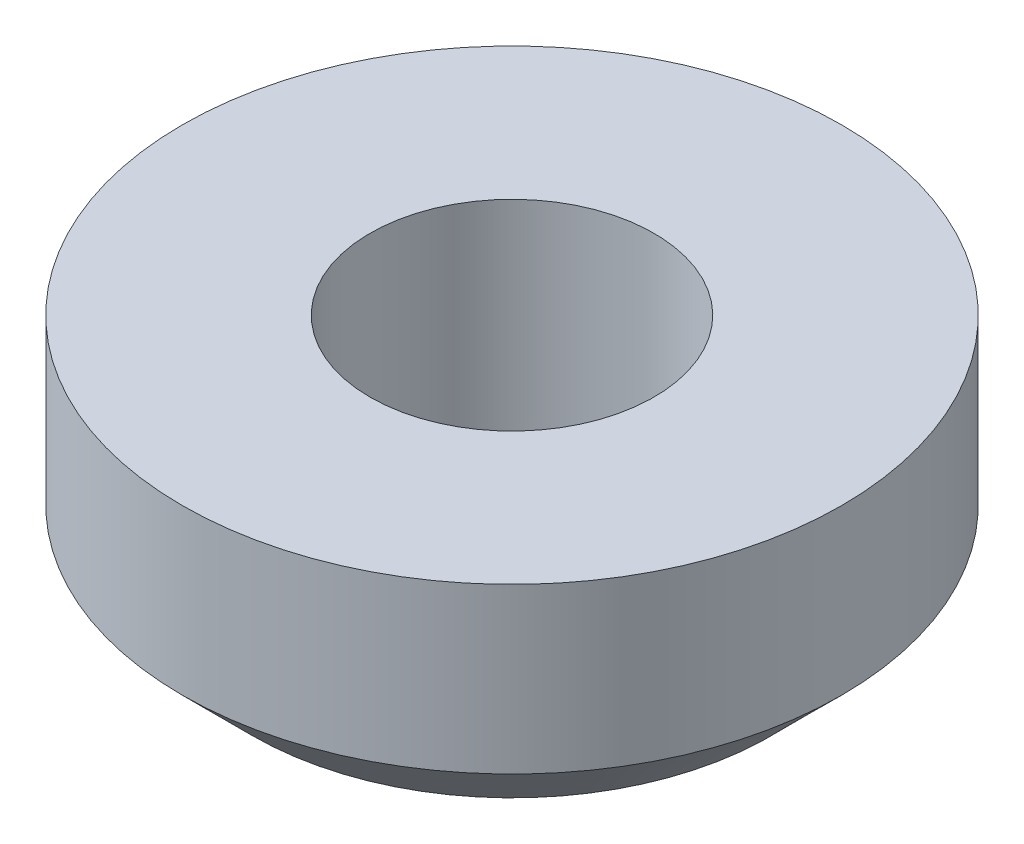
ISO-10303-21;
HEADER;
FILE_DESCRIPTION(('STEP AP214'),'2;1');
FILE_NAME('part.step','',(''),(''),'','','');
FILE_SCHEMA(('AUTOMOTIVE_DESIGN { 1 0 10303 214 1 1 1 1 }'));
ENDSEC;
DATA;
#1=APPLICATION_CONTEXT('core data for automotive mechanical design processes');
#2=APPLICATION_PROTOCOL_DEFINITION('international standard','automotive_design',2000,#1);
#3=PRODUCT_CONTEXT('',#1,'mechanical');
#4=PRODUCT('Part','Part','',(#3));
#5=PRODUCT_RELATED_PRODUCT_CATEGORY('part','',(#4));
#6=PRODUCT_DEFINITION_FORMATION('','',#4);
#7=PRODUCT_DEFINITION_CONTEXT('part definition',#1,'design');
#8=PRODUCT_DEFINITION('design','',#6,#7);
#9=PRODUCT_DEFINITION_SHAPE('','',#8);
#10=(LENGTH_UNIT() NAMED_UNIT(*) SI_UNIT(.MILLI.,.METRE.));
#11=(NAMED_UNIT(*) PLANE_ANGLE_UNIT() SI_UNIT($,.RADIAN.));
#12=(NAMED_UNIT(*) SI_UNIT($,.STERADIAN.) SOLID_ANGLE_UNIT());
#13=UNCERTAINTY_MEASURE_WITH_UNIT(LENGTH_MEASURE(1.E-05),#10,'distance_accuracy_value','');
#14=(GEOMETRIC_REPRESENTATION_CONTEXT(3) GLOBAL_UNCERTAINTY_ASSIGNED_CONTEXT((#13)) GLOBAL_UNIT_ASSIGNED_CONTEXT((#10,
#11,#12)) REPRESENTATION_CONTEXT('',''));
#15=CARTESIAN_POINT('',(0.,0.,0.));
#16=DIRECTION('',(0.,0.,1.));
#17=DIRECTION('',(1.,0.,0.));
#18=AXIS2_PLACEMENT_3D('',#15,#16,#17);
#19=CARTESIAN_POINT('',(0.,5.,0.));
#20=DIRECTION('',(0.,1.,0.));
#21=DIRECTION('',(0.,0.,1.));
#22=AXIS2_PLACEMENT_3D('',#19,#20,#21);
#23=PLANE('',#22);
#24=CARTESIAN_POINT('',(0.,5.,0.));
#25=DIRECTION('',(0.,1.,0.));
#26=DIRECTION('',(0.,0.,1.));
#27=AXIS2_PLACEMENT_3D('',#24,#25,#26);
#28=CIRCLE('',#27,7.025);
#29=CARTESIAN_POINT('',(0.,5.,7.025));
#30=VERTEX_POINT('',#29);
#31=EDGE_CURVE('E48',#30,#30,#28,.T.);
#32=ORIENTED_EDGE('',*,*,#31,.T.);
#33=EDGE_LOOP('',(#32));
#34=FACE_BOUND('',#33,.T.);
#35=CARTESIAN_POINT('',(0.,5.,0.));
#36=DIRECTION('',(0.,1.,0.));
#37=DIRECTION('',(0.,0.,1.));
#38=AXIS2_PLACEMENT_3D('',#35,#36,#37);
#39=CIRCLE('',#38,3.025);
#40=CARTESIAN_POINT('',(0.,5.,3.025));
#41=VERTEX_POINT('',#40);
#42=EDGE_CURVE('E52',#41,#41,#39,.T.);
#43=ORIENTED_EDGE('',*,*,#42,.F.);
#44=EDGE_LOOP('',(#43));
#45=FACE_BOUND('',#44,.T.);
#46=ADVANCED_FACE('F36',(#34,#45),#23,.T.);
#47=CARTESIAN_POINT('',(0.,0.,0.));
#48=DIRECTION('',(0.,1.,0.));
#49=DIRECTION('',(0.,0.,1.));
#50=AXIS2_PLACEMENT_3D('',#47,#48,#49);
#51=PLANE('',#50);
#52=CARTESIAN_POINT('',(0.,0.,0.));
#53=DIRECTION('',(0.,1.,0.));
#54=DIRECTION('',(0.,0.,1.));
#55=AXIS2_PLACEMENT_3D('',#52,#53,#54);
#56=CIRCLE('',#55,5.525);
#57=CARTESIAN_POINT('',(0.,0.,5.525));
#58=VERTEX_POINT('',#57);
#59=EDGE_CURVE('E10',#58,#58,#56,.F.);
#60=ORIENTED_EDGE('',*,*,#59,.T.);
#61=EDGE_LOOP('',(#60));
#62=FACE_BOUND('',#61,.T.);
#63=CARTESIAN_POINT('',(0.,0.,0.));
#64=DIRECTION('',(0.,1.,0.));
#65=DIRECTION('',(0.,0.,1.));
#66=AXIS2_PLACEMENT_3D('',#63,#64,#65);
#67=CIRCLE('',#66,3.025);
#68=CARTESIAN_POINT('',(0.,0.,3.025));
#69=VERTEX_POINT('',#68);
#70=EDGE_CURVE('E55',#69,#69,#67,.T.);
#71=ORIENTED_EDGE('',*,*,#70,.T.);
#72=EDGE_LOOP('',(#71));
#73=FACE_BOUND('',#72,.T.);
#74=ADVANCED_FACE('F65',(#62,#73),#51,.F.);
#75=CARTESIAN_POINT('',(0.,5.,0.));
#76=DIRECTION('',(0.,-1.,0.));
#77=DIRECTION('',(0.,0.,-1.));
#78=AXIS2_PLACEMENT_3D('',#75,#76,#77);
#79=CYLINDRICAL_SURFACE('',#78,7.025);
#80=CARTESIAN_POINT('',(0.,1.5,0.));
#81=DIRECTION('',(0.,1.,0.));
#82=DIRECTION('',(0.,0.,1.));
#83=AXIS2_PLACEMENT_3D('',#80,#81,#82);
#84=CIRCLE('',#83,7.025);
#85=CARTESIAN_POINT('',(0.,1.5,7.025));
#86=VERTEX_POINT('',#85);
#87=EDGE_CURVE('E44',#86,#86,#84,.T.);
#88=ORIENTED_EDGE('',*,*,#87,.T.);
#89=EDGE_LOOP('',(#88));
#90=FACE_BOUND('',#89,.T.);
#91=ORIENTED_EDGE('',*,*,#31,.F.);
#92=EDGE_LOOP('',(#91));
#93=FACE_BOUND('',#92,.T.);
#94=ADVANCED_FACE('F71',(#90,#93),#79,.T.);
#95=CARTESIAN_POINT('',(0.,5.,0.));
#96=DIRECTION('',(0.,-1.,0.));
#97=DIRECTION('',(0.,0.,-1.));
#98=AXIS2_PLACEMENT_3D('',#95,#96,#97);
#99=CYLINDRICAL_SURFACE('',#98,3.025);
#100=ORIENTED_EDGE('',*,*,#42,.T.);
#101=EDGE_LOOP('',(#100));
#102=FACE_BOUND('',#101,.T.);
#103=ORIENTED_EDGE('',*,*,#70,.F.);
#104=EDGE_LOOP('',(#103));
#105=FACE_BOUND('',#104,.T.);
#106=ADVANCED_FACE('F61',(#102,#105),#99,.F.);
#107=CARTESIAN_POINT('',(0.,1.5,0.));
#108=DIRECTION('',(0.,1.,0.));
#109=DIRECTION('',(0.,0.,1.));
#110=AXIS2_PLACEMENT_3D('',#107,#108,#109);
#111=CONICAL_SURFACE('',#110,7.025,0.78539816339745);
#112=ORIENTED_EDGE('',*,*,#59,.F.);
#113=EDGE_LOOP('',(#112));
#114=FACE_BOUND('',#113,.T.);
#115=ORIENTED_EDGE('',*,*,#87,.F.);
#116=EDGE_LOOP('',(#115));
#117=FACE_BOUND('',#116,.T.);
#118=ADVANCED_FACE('F39',(#114,#117),#111,.T.);
#119=CLOSED_SHELL('',(#46,#74,#94,#106,#118));
#120=MANIFOLD_SOLID_BREP('B2',#119);
#121=ADVANCED_BREP_SHAPE_REPRESENTATION('',(#18,#120),#14);
#122=SHAPE_DEFINITION_REPRESENTATION(#9,#121);
ENDSEC;
END-ISO-10303-21;
